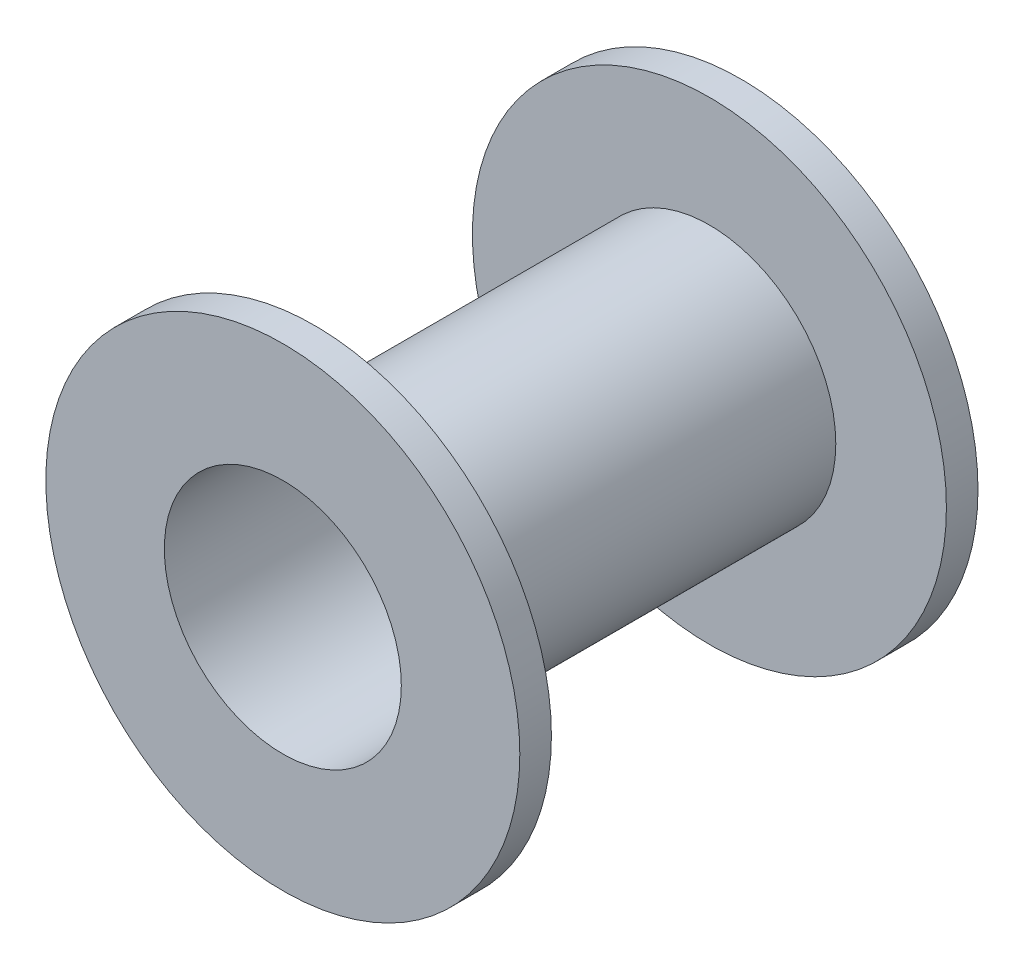
ISO-10303-21;
HEADER;
FILE_DESCRIPTION(('STEP AP214'),'2;1');
FILE_NAME('part.step','',(''),(''),'','','');
FILE_SCHEMA(('AUTOMOTIVE_DESIGN { 1 0 10303 214 1 1 1 1 }'));
ENDSEC;
DATA;
#1=APPLICATION_CONTEXT('core data for automotive mechanical design processes');
#2=APPLICATION_PROTOCOL_DEFINITION('international standard','automotive_design',2000,#1);
#3=PRODUCT_CONTEXT('',#1,'mechanical');
#4=PRODUCT('Part','Part','',(#3));
#5=PRODUCT_RELATED_PRODUCT_CATEGORY('part','',(#4));
#6=PRODUCT_DEFINITION_FORMATION('','',#4);
#7=PRODUCT_DEFINITION_CONTEXT('part definition',#1,'design');
#8=PRODUCT_DEFINITION('design','',#6,#7);
#9=PRODUCT_DEFINITION_SHAPE('','',#8);
#10=(LENGTH_UNIT() NAMED_UNIT(*) SI_UNIT(.MILLI.,.METRE.));
#11=(NAMED_UNIT(*) PLANE_ANGLE_UNIT() SI_UNIT($,.RADIAN.));
#12=(NAMED_UNIT(*) SI_UNIT($,.STERADIAN.) SOLID_ANGLE_UNIT());
#13=UNCERTAINTY_MEASURE_WITH_UNIT(LENGTH_MEASURE(1.E-05),#10,'distance_accuracy_value','');
#14=(GEOMETRIC_REPRESENTATION_CONTEXT(3) GLOBAL_UNCERTAINTY_ASSIGNED_CONTEXT((#13)) GLOBAL_UNIT_ASSIGNED_CONTEXT((#10,
#11,#12)) REPRESENTATION_CONTEXT('',''));
#15=CARTESIAN_POINT('',(0.,0.,0.));
#16=DIRECTION('',(0.,0.,1.));
#17=DIRECTION('',(1.,0.,0.));
#18=AXIS2_PLACEMENT_3D('',#15,#16,#17);
#19=CARTESIAN_POINT('',(0.,0.,50.));
#20=DIRECTION('',(0.,0.,-1.));
#21=DIRECTION('',(-1.,0.,0.));
#22=AXIS2_PLACEMENT_3D('',#19,#20,#21);
#23=CYLINDRICAL_SURFACE('',#22,16.);
#24=CARTESIAN_POINT('',(0.,0.,50.));
#25=DIRECTION('',(0.,0.,1.));
#26=DIRECTION('',(1.,0.,0.));
#27=AXIS2_PLACEMENT_3D('',#24,#25,#26);
#28=CIRCLE('',#27,16.);
#29=CARTESIAN_POINT('',(16.,0.,50.));
#30=VERTEX_POINT('',#29);
#31=EDGE_CURVE('E10',#30,#30,#28,.T.);
#32=ORIENTED_EDGE('',*,*,#31,.F.);
#33=EDGE_LOOP('',(#32));
#34=FACE_BOUND('',#33,.T.);
#35=CARTESIAN_POINT('',(0.,0.,0.));
#36=DIRECTION('',(0.,0.,1.));
#37=DIRECTION('',(1.,0.,0.));
#38=AXIS2_PLACEMENT_3D('',#35,#36,#37);
#39=CIRCLE('',#38,16.);
#40=CARTESIAN_POINT('',(16.,0.,0.));
#41=VERTEX_POINT('',#40);
#42=EDGE_CURVE('E34',#41,#41,#39,.T.);
#43=ORIENTED_EDGE('',*,*,#42,.T.);
#44=EDGE_LOOP('',(#43));
#45=FACE_BOUND('',#44,.T.);
#46=ADVANCED_FACE('F31',(#34,#45),#23,.T.);
#47=CARTESIAN_POINT('',(0.,0.,50.));
#48=DIRECTION('',(0.,0.,-1.));
#49=DIRECTION('',(-1.,0.,0.));
#50=AXIS2_PLACEMENT_3D('',#47,#48,#49);
#51=CYLINDRICAL_SURFACE('',#50,15.);
#52=CARTESIAN_POINT('',(0.,0.,54.));
#53=DIRECTION('',(0.,0.,1.));
#54=DIRECTION('',(1.,0.,0.));
#55=AXIS2_PLACEMENT_3D('',#52,#53,#54);
#56=CIRCLE('',#55,15.);
#57=CARTESIAN_POINT('',(15.,0.,54.));
#58=VERTEX_POINT('',#57);
#59=EDGE_CURVE('E46',#58,#58,#56,.T.);
#60=ORIENTED_EDGE('',*,*,#59,.T.);
#61=EDGE_LOOP('',(#60));
#62=FACE_BOUND('',#61,.T.);
#63=CARTESIAN_POINT('',(0.,0.,-4.));
#64=DIRECTION('',(0.,0.,1.));
#65=DIRECTION('',(1.,0.,0.));
#66=AXIS2_PLACEMENT_3D('',#63,#64,#65);
#67=CIRCLE('',#66,15.);
#68=CARTESIAN_POINT('',(15.,0.,-4.));
#69=VERTEX_POINT('',#68);
#70=EDGE_CURVE('E54',#69,#69,#67,.T.);
#71=ORIENTED_EDGE('',*,*,#70,.F.);
#72=EDGE_LOOP('',(#71));
#73=FACE_BOUND('',#72,.T.);
#74=ADVANCED_FACE('F63',(#62,#73),#51,.F.);
#75=CARTESIAN_POINT('',(0.,0.,54.));
#76=DIRECTION('',(0.,0.,1.));
#77=DIRECTION('',(1.,0.,0.));
#78=AXIS2_PLACEMENT_3D('',#75,#76,#77);
#79=PLANE('',#78);
#80=CARTESIAN_POINT('',(0.,0.,54.));
#81=DIRECTION('',(0.,0.,1.));
#82=DIRECTION('',(1.,0.,0.));
#83=AXIS2_PLACEMENT_3D('',#80,#81,#82);
#84=CIRCLE('',#83,30.);
#85=CARTESIAN_POINT('',(30.,0.,54.));
#86=VERTEX_POINT('',#85);
#87=EDGE_CURVE('E38',#86,#86,#84,.T.);
#88=ORIENTED_EDGE('',*,*,#87,.T.);
#89=EDGE_LOOP('',(#88));
#90=FACE_BOUND('',#89,.T.);
#91=ORIENTED_EDGE('',*,*,#59,.F.);
#92=EDGE_LOOP('',(#91));
#93=FACE_BOUND('',#92,.T.);
#94=ADVANCED_FACE('F65',(#90,#93),#79,.T.);
#95=CARTESIAN_POINT('',(0.,0.,50.));
#96=DIRECTION('',(0.,0.,1.));
#97=DIRECTION('',(1.,0.,0.));
#98=AXIS2_PLACEMENT_3D('',#95,#96,#97);
#99=PLANE('',#98);
#100=ORIENTED_EDGE('',*,*,#31,.T.);
#101=EDGE_LOOP('',(#100));
#102=FACE_BOUND('',#101,.T.);
#103=CARTESIAN_POINT('',(0.,0.,50.));
#104=DIRECTION('',(0.,0.,1.));
#105=DIRECTION('',(1.,0.,0.));
#106=AXIS2_PLACEMENT_3D('',#103,#104,#105);
#107=CIRCLE('',#106,30.);
#108=CARTESIAN_POINT('',(30.,0.,50.));
#109=VERTEX_POINT('',#108);
#110=EDGE_CURVE('E42',#109,#109,#107,.T.);
#111=ORIENTED_EDGE('',*,*,#110,.F.);
#112=EDGE_LOOP('',(#111));
#113=FACE_BOUND('',#112,.T.);
#114=ADVANCED_FACE('F71',(#102,#113),#99,.F.);
#115=CARTESIAN_POINT('',(0.,0.,54.));
#116=DIRECTION('',(0.,0.,-1.));
#117=DIRECTION('',(-1.,0.,0.));
#118=AXIS2_PLACEMENT_3D('',#115,#116,#117);
#119=CYLINDRICAL_SURFACE('',#118,30.);
#120=ORIENTED_EDGE('',*,*,#87,.F.);
#121=EDGE_LOOP('',(#120));
#122=FACE_BOUND('',#121,.T.);
#123=ORIENTED_EDGE('',*,*,#110,.T.);
#124=EDGE_LOOP('',(#123));
#125=FACE_BOUND('',#124,.T.);
#126=ADVANCED_FACE('F76',(#122,#125),#119,.T.);
#127=CARTESIAN_POINT('',(0.,0.,-4.));
#128=DIRECTION('',(0.,0.,1.));
#129=DIRECTION('',(1.,0.,0.));
#130=AXIS2_PLACEMENT_3D('',#127,#128,#129);
#131=CYLINDRICAL_SURFACE('',#130,30.);
#132=CARTESIAN_POINT('',(0.,0.,-4.));
#133=DIRECTION('',(0.,0.,1.));
#134=DIRECTION('',(1.,0.,0.));
#135=AXIS2_PLACEMENT_3D('',#132,#133,#134);
#136=CIRCLE('',#135,30.);
#137=CARTESIAN_POINT('',(30.,0.,-4.));
#138=VERTEX_POINT('',#137);
#139=EDGE_CURVE('E53',#138,#138,#136,.T.);
#140=ORIENTED_EDGE('',*,*,#139,.T.);
#141=EDGE_LOOP('',(#140));
#142=FACE_BOUND('',#141,.T.);
#143=CARTESIAN_POINT('',(0.,0.,0.));
#144=DIRECTION('',(0.,0.,1.));
#145=DIRECTION('',(1.,0.,0.));
#146=AXIS2_PLACEMENT_3D('',#143,#144,#145);
#147=CIRCLE('',#146,30.);
#148=CARTESIAN_POINT('',(30.,0.,0.));
#149=VERTEX_POINT('',#148);
#150=EDGE_CURVE('E50',#149,#149,#147,.T.);
#151=ORIENTED_EDGE('',*,*,#150,.F.);
#152=EDGE_LOOP('',(#151));
#153=FACE_BOUND('',#152,.T.);
#154=ADVANCED_FACE('F79',(#142,#153),#131,.T.);
#155=CARTESIAN_POINT('',(0.,0.,-4.));
#156=DIRECTION('',(0.,0.,-1.));
#157=DIRECTION('',(1.,0.,0.));
#158=AXIS2_PLACEMENT_3D('',#155,#156,#157);
#159=PLANE('',#158);
#160=ORIENTED_EDGE('',*,*,#70,.T.);
#161=EDGE_LOOP('',(#160));
#162=FACE_BOUND('',#161,.T.);
#163=ORIENTED_EDGE('',*,*,#139,.F.);
#164=EDGE_LOOP('',(#163));
#165=FACE_BOUND('',#164,.T.);
#166=ADVANCED_FACE('F60',(#162,#165),#159,.T.);
#167=CARTESIAN_POINT('',(0.,0.,0.));
#168=DIRECTION('',(0.,0.,-1.));
#169=DIRECTION('',(1.,0.,0.));
#170=AXIS2_PLACEMENT_3D('',#167,#168,#169);
#171=PLANE('',#170);
#172=ORIENTED_EDGE('',*,*,#42,.F.);
#173=EDGE_LOOP('',(#172));
#174=FACE_BOUND('',#173,.T.);
#175=ORIENTED_EDGE('',*,*,#150,.T.);
#176=EDGE_LOOP('',(#175));
#177=FACE_BOUND('',#176,.T.);
#178=ADVANCED_FACE('F86',(#174,#177),#171,.F.);
#179=CLOSED_SHELL('',(#46,#74,#94,#114,#126,#154,#166,#178));
#180=MANIFOLD_SOLID_BREP('B2',#179);
#181=ADVANCED_BREP_SHAPE_REPRESENTATION('',(#18,#180),#14);
#182=SHAPE_DEFINITION_REPRESENTATION(#9,#181);
ENDSEC;
END-ISO-10303-21;
